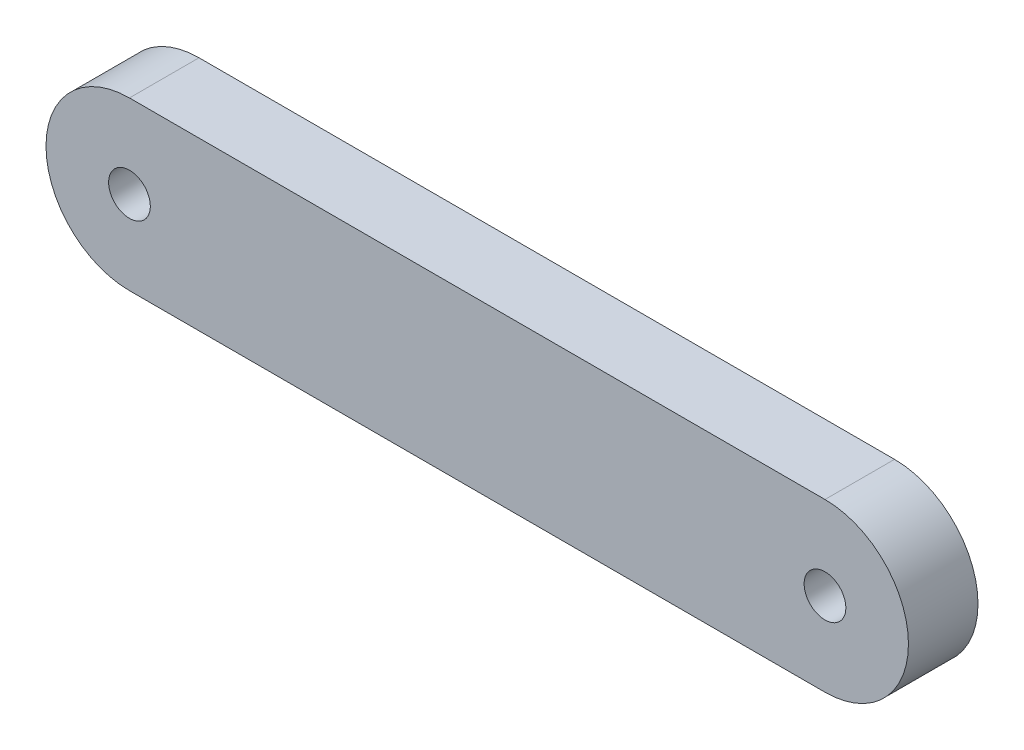
ISO-10303-21;
HEADER;
FILE_DESCRIPTION(('STEP AP214'),'2;1');
FILE_NAME('part.step','',(''),(''),'','','');
FILE_SCHEMA(('AUTOMOTIVE_DESIGN { 1 0 10303 214 1 1 1 1 }'));
ENDSEC;
DATA;
#1=APPLICATION_CONTEXT('core data for automotive mechanical design processes');
#2=APPLICATION_PROTOCOL_DEFINITION('international standard','automotive_design',2000,#1);
#3=PRODUCT_CONTEXT('',#1,'mechanical');
#4=PRODUCT('Part','Part','',(#3));
#5=PRODUCT_RELATED_PRODUCT_CATEGORY('part','',(#4));
#6=PRODUCT_DEFINITION_FORMATION('','',#4);
#7=PRODUCT_DEFINITION_CONTEXT('part definition',#1,'design');
#8=PRODUCT_DEFINITION('design','',#6,#7);
#9=PRODUCT_DEFINITION_SHAPE('','',#8);
#10=(LENGTH_UNIT() NAMED_UNIT(*) SI_UNIT(.MILLI.,.METRE.));
#11=(NAMED_UNIT(*) PLANE_ANGLE_UNIT() SI_UNIT($,.RADIAN.));
#12=(NAMED_UNIT(*) SI_UNIT($,.STERADIAN.) SOLID_ANGLE_UNIT());
#13=UNCERTAINTY_MEASURE_WITH_UNIT(LENGTH_MEASURE(1.E-05),#10,'distance_accuracy_value','');
#14=(GEOMETRIC_REPRESENTATION_CONTEXT(3) GLOBAL_UNCERTAINTY_ASSIGNED_CONTEXT((#13)) GLOBAL_UNIT_ASSIGNED_CONTEXT((#10,
#11,#12)) REPRESENTATION_CONTEXT('',''));
#15=CARTESIAN_POINT('',(0.,0.,0.));
#16=DIRECTION('',(0.,0.,1.));
#17=DIRECTION('',(1.,0.,0.));
#18=AXIS2_PLACEMENT_3D('',#15,#16,#17);
#19=CARTESIAN_POINT('',(-25.,0.,5.));
#20=DIRECTION('',(0.,0.,1.));
#21=DIRECTION('',(1.,0.,0.));
#22=AXIS2_PLACEMENT_3D('',#19,#20,#21);
#23=PLANE('',#22);
#24=CARTESIAN_POINT('',(-25.,0.,5.));
#25=DIRECTION('',(0.,0.,1.));
#26=DIRECTION('',(1.,0.,0.));
#27=AXIS2_PLACEMENT_3D('',#24,#25,#26);
#28=CIRCLE('',#27,1.5);
#29=CARTESIAN_POINT('',(-23.5,0.,5.));
#30=VERTEX_POINT('',#29);
#31=EDGE_CURVE('E100',#30,#30,#28,.T.);
#32=ORIENTED_EDGE('',*,*,#31,.F.);
#33=EDGE_LOOP('',(#32));
#34=FACE_BOUND('',#33,.T.);
#35=CARTESIAN_POINT('',(-25.,0.,5.));
#36=DIRECTION('',(0.,0.,1.));
#37=DIRECTION('',(1.,0.,0.));
#38=AXIS2_PLACEMENT_3D('',#35,#36,#37);
#39=CIRCLE('',#38,6.);
#40=CARTESIAN_POINT('',(-25.,6.,5.));
#41=VERTEX_POINT('',#40);
#42=CARTESIAN_POINT('',(-25.,-6.,5.));
#43=VERTEX_POINT('',#42);
#44=EDGE_CURVE('E85',#41,#43,#39,.T.);
#45=ORIENTED_EDGE('',*,*,#44,.T.);
#46=DIRECTION('',(1.,0.,0.));
#47=VECTOR('',#46,1.);
#48=CARTESIAN_POINT('',(-25.,-6.,5.));
#49=LINE('',#48,#47);
#50=CARTESIAN_POINT('',(25.,-6.,5.));
#51=VERTEX_POINT('',#50);
#52=EDGE_CURVE('E80',#43,#51,#49,.T.);
#53=ORIENTED_EDGE('',*,*,#52,.T.);
#54=CARTESIAN_POINT('',(25.,0.,5.));
#55=DIRECTION('',(0.,0.,1.));
#56=DIRECTION('',(1.,0.,0.));
#57=AXIS2_PLACEMENT_3D('',#54,#55,#56);
#58=CIRCLE('',#57,6.);
#59=CARTESIAN_POINT('',(25.,6.,5.));
#60=VERTEX_POINT('',#59);
#61=EDGE_CURVE('E83',#51,#60,#58,.T.);
#62=ORIENTED_EDGE('',*,*,#61,.T.);
#63=DIRECTION('',(-1.,0.,0.));
#64=VECTOR('',#63,1.);
#65=CARTESIAN_POINT('',(-25.,6.,5.));
#66=LINE('',#65,#64);
#67=EDGE_CURVE('E50',#60,#41,#66,.T.);
#68=ORIENTED_EDGE('',*,*,#67,.T.);
#69=EDGE_LOOP('',(#45,#53,#62,#68));
#70=FACE_BOUND('',#69,.T.);
#71=CARTESIAN_POINT('',(25.,0.,5.));
#72=DIRECTION('',(0.,0.,1.));
#73=DIRECTION('',(1.,0.,0.));
#74=AXIS2_PLACEMENT_3D('',#71,#72,#73);
#75=CIRCLE('',#74,1.5);
#76=CARTESIAN_POINT('',(26.5,0.,5.));
#77=VERTEX_POINT('',#76);
#78=EDGE_CURVE('E115',#77,#77,#75,.T.);
#79=ORIENTED_EDGE('',*,*,#78,.F.);
#80=EDGE_LOOP('',(#79));
#81=FACE_BOUND('',#80,.T.);
#82=ADVANCED_FACE('F33',(#34,#70,#81),#23,.T.);
#83=CARTESIAN_POINT('',(-25.,0.,0.));
#84=DIRECTION('',(0.,0.,1.));
#85=DIRECTION('',(1.,0.,0.));
#86=AXIS2_PLACEMENT_3D('',#83,#84,#85);
#87=PLANE('',#86);
#88=CARTESIAN_POINT('',(-25.,0.,0.));
#89=DIRECTION('',(0.,0.,1.));
#90=DIRECTION('',(1.,0.,0.));
#91=AXIS2_PLACEMENT_3D('',#88,#89,#90);
#92=CIRCLE('',#91,6.);
#93=CARTESIAN_POINT('',(-25.,6.,0.));
#94=VERTEX_POINT('',#93);
#95=CARTESIAN_POINT('',(-25.,-6.,0.));
#96=VERTEX_POINT('',#95);
#97=EDGE_CURVE('E97',#94,#96,#92,.T.);
#98=ORIENTED_EDGE('',*,*,#97,.F.);
#99=DIRECTION('',(-1.,0.,0.));
#100=VECTOR('',#99,1.);
#101=CARTESIAN_POINT('',(-25.,6.,0.));
#102=LINE('',#101,#100);
#103=CARTESIAN_POINT('',(25.,6.,0.));
#104=VERTEX_POINT('',#103);
#105=EDGE_CURVE('E73',#104,#94,#102,.T.);
#106=ORIENTED_EDGE('',*,*,#105,.F.);
#107=CARTESIAN_POINT('',(25.,0.,0.));
#108=DIRECTION('',(0.,0.,1.));
#109=DIRECTION('',(1.,0.,0.));
#110=AXIS2_PLACEMENT_3D('',#107,#108,#109);
#111=CIRCLE('',#110,6.);
#112=CARTESIAN_POINT('',(25.,-6.,0.));
#113=VERTEX_POINT('',#112);
#114=EDGE_CURVE('E67',#113,#104,#111,.T.);
#115=ORIENTED_EDGE('',*,*,#114,.F.);
#116=DIRECTION('',(1.,0.,0.));
#117=VECTOR('',#116,1.);
#118=CARTESIAN_POINT('',(-25.,-6.,0.));
#119=LINE('',#118,#117);
#120=EDGE_CURVE('E89',#96,#113,#119,.T.);
#121=ORIENTED_EDGE('',*,*,#120,.F.);
#122=EDGE_LOOP('',(#98,#106,#115,#121));
#123=FACE_BOUND('',#122,.T.);
#124=CARTESIAN_POINT('',(-25.,0.,0.));
#125=DIRECTION('',(0.,0.,1.));
#126=DIRECTION('',(1.,0.,0.));
#127=AXIS2_PLACEMENT_3D('',#124,#125,#126);
#128=CIRCLE('',#127,1.5);
#129=CARTESIAN_POINT('',(-23.5,0.,0.));
#130=VERTEX_POINT('',#129);
#131=EDGE_CURVE('E112',#130,#130,#128,.T.);
#132=ORIENTED_EDGE('',*,*,#131,.T.);
#133=EDGE_LOOP('',(#132));
#134=FACE_BOUND('',#133,.T.);
#135=CARTESIAN_POINT('',(25.,0.,0.));
#136=DIRECTION('',(0.,0.,1.));
#137=DIRECTION('',(1.,0.,0.));
#138=AXIS2_PLACEMENT_3D('',#135,#136,#137);
#139=CIRCLE('',#138,1.5);
#140=CARTESIAN_POINT('',(26.5,0.,0.));
#141=VERTEX_POINT('',#140);
#142=EDGE_CURVE('E118',#141,#141,#139,.T.);
#143=ORIENTED_EDGE('',*,*,#142,.T.);
#144=EDGE_LOOP('',(#143));
#145=FACE_BOUND('',#144,.T.);
#146=ADVANCED_FACE('F108',(#123,#134,#145),#87,.F.);
#147=CARTESIAN_POINT('',(-25.,0.,5.));
#148=DIRECTION('',(0.,0.,-1.));
#149=DIRECTION('',(-1.,0.,0.));
#150=AXIS2_PLACEMENT_3D('',#147,#148,#149);
#151=CYLINDRICAL_SURFACE('',#150,6.);
#152=ORIENTED_EDGE('',*,*,#97,.T.);
#153=DIRECTION('',(0.,0.,-1.));
#154=VECTOR('',#153,1.);
#155=CARTESIAN_POINT('',(-25.,-6.,5.));
#156=LINE('',#155,#154);
#157=EDGE_CURVE('E11',#43,#96,#156,.T.);
#158=ORIENTED_EDGE('',*,*,#157,.F.);
#159=ORIENTED_EDGE('',*,*,#44,.F.);
#160=DIRECTION('',(0.,0.,-1.));
#161=VECTOR('',#160,1.);
#162=CARTESIAN_POINT('',(-25.,6.,5.));
#163=LINE('',#162,#161);
#164=EDGE_CURVE('E93',#41,#94,#163,.T.);
#165=ORIENTED_EDGE('',*,*,#164,.T.);
#166=EDGE_LOOP('',(#152,#158,#159,#165));
#167=FACE_BOUND('',#166,.T.);
#168=ADVANCED_FACE('F35',(#167),#151,.T.);
#169=CARTESIAN_POINT('',(-25.,-6.,5.));
#170=DIRECTION('',(0.,1.,0.));
#171=DIRECTION('',(0.,0.,1.));
#172=AXIS2_PLACEMENT_3D('',#169,#170,#171);
#173=PLANE('',#172);
#174=ORIENTED_EDGE('',*,*,#120,.T.);
#175=DIRECTION('',(0.,0.,-1.));
#176=VECTOR('',#175,1.);
#177=CARTESIAN_POINT('',(25.,-6.,5.));
#178=LINE('',#177,#176);
#179=EDGE_CURVE('E42',#51,#113,#178,.T.);
#180=ORIENTED_EDGE('',*,*,#179,.F.);
#181=ORIENTED_EDGE('',*,*,#52,.F.);
#182=ORIENTED_EDGE('',*,*,#157,.T.);
#183=EDGE_LOOP('',(#174,#180,#181,#182));
#184=FACE_BOUND('',#183,.T.);
#185=ADVANCED_FACE('F88',(#184),#173,.F.);
#186=CARTESIAN_POINT('',(25.,0.,5.));
#187=DIRECTION('',(0.,0.,-1.));
#188=DIRECTION('',(-1.,0.,0.));
#189=AXIS2_PLACEMENT_3D('',#186,#187,#188);
#190=CYLINDRICAL_SURFACE('',#189,6.);
#191=ORIENTED_EDGE('',*,*,#114,.T.);
#192=DIRECTION('',(0.,0.,-1.));
#193=VECTOR('',#192,1.);
#194=CARTESIAN_POINT('',(25.,6.,5.));
#195=LINE('',#194,#193);
#196=EDGE_CURVE('E90',#60,#104,#195,.T.);
#197=ORIENTED_EDGE('',*,*,#196,.F.);
#198=ORIENTED_EDGE('',*,*,#61,.F.);
#199=ORIENTED_EDGE('',*,*,#179,.T.);
#200=EDGE_LOOP('',(#191,#197,#198,#199));
#201=FACE_BOUND('',#200,.T.);
#202=ADVANCED_FACE('F91',(#201),#190,.T.);
#203=CARTESIAN_POINT('',(-25.,6.,5.));
#204=DIRECTION('',(0.,-1.,0.));
#205=DIRECTION('',(0.,0.,-1.));
#206=AXIS2_PLACEMENT_3D('',#203,#204,#205);
#207=PLANE('',#206);
#208=ORIENTED_EDGE('',*,*,#105,.T.);
#209=ORIENTED_EDGE('',*,*,#164,.F.);
#210=ORIENTED_EDGE('',*,*,#67,.F.);
#211=ORIENTED_EDGE('',*,*,#196,.T.);
#212=EDGE_LOOP('',(#208,#209,#210,#211));
#213=FACE_BOUND('',#212,.T.);
#214=ADVANCED_FACE('F105',(#213),#207,.F.);
#215=CARTESIAN_POINT('',(-25.,0.,5.));
#216=DIRECTION('',(0.,0.,-1.));
#217=DIRECTION('',(-1.,0.,0.));
#218=AXIS2_PLACEMENT_3D('',#215,#216,#217);
#219=CYLINDRICAL_SURFACE('',#218,1.5);
#220=ORIENTED_EDGE('',*,*,#31,.T.);
#221=EDGE_LOOP('',(#220));
#222=FACE_BOUND('',#221,.T.);
#223=ORIENTED_EDGE('',*,*,#131,.F.);
#224=EDGE_LOOP('',(#223));
#225=FACE_BOUND('',#224,.T.);
#226=ADVANCED_FACE('F135',(#222,#225),#219,.F.);
#227=CARTESIAN_POINT('',(25.,0.,5.));
#228=DIRECTION('',(0.,0.,-1.));
#229=DIRECTION('',(-1.,0.,0.));
#230=AXIS2_PLACEMENT_3D('',#227,#228,#229);
#231=CYLINDRICAL_SURFACE('',#230,1.5);
#232=ORIENTED_EDGE('',*,*,#78,.T.);
#233=EDGE_LOOP('',(#232));
#234=FACE_BOUND('',#233,.T.);
#235=ORIENTED_EDGE('',*,*,#142,.F.);
#236=EDGE_LOOP('',(#235));
#237=FACE_BOUND('',#236,.T.);
#238=ADVANCED_FACE('F124',(#234,#237),#231,.F.);
#239=CLOSED_SHELL('',(#82,#146,#168,#185,#202,#214,#226,#238));
#240=MANIFOLD_SOLID_BREP('B2',#239);
#241=ADVANCED_BREP_SHAPE_REPRESENTATION('',(#18,#240),#14);
#242=SHAPE_DEFINITION_REPRESENTATION(#9,#241);
ENDSEC;
END-ISO-10303-21;
